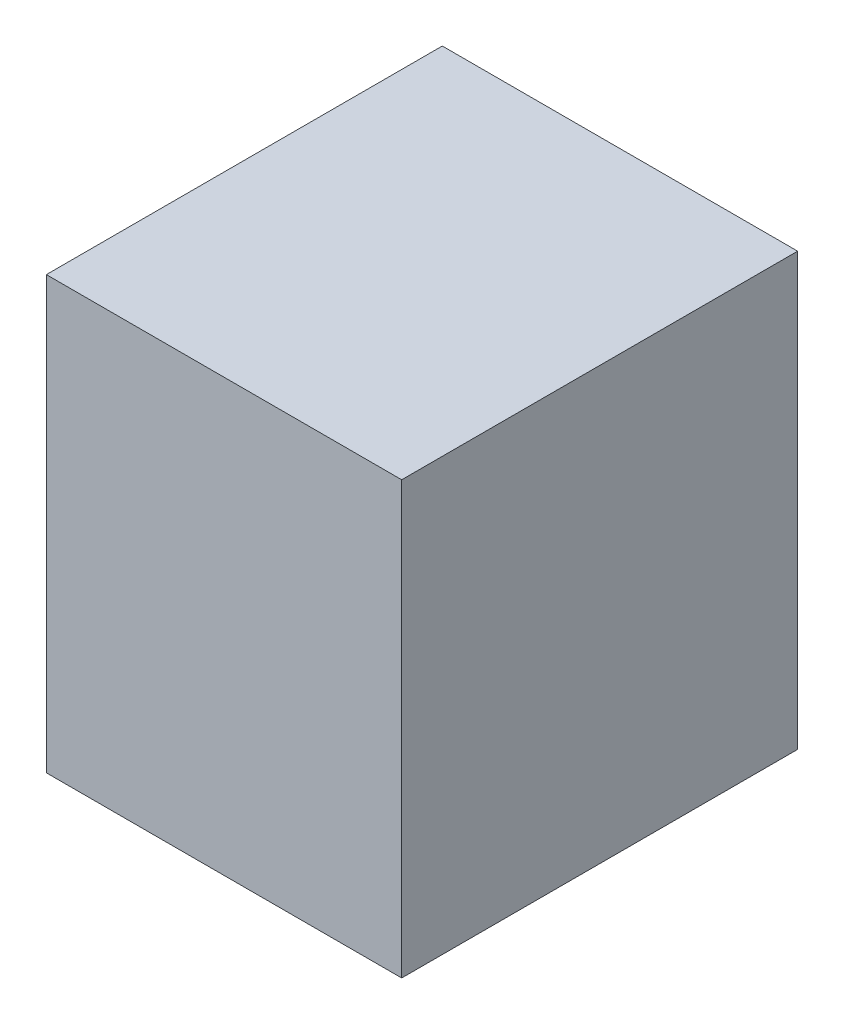
ISO-10303-21;
HEADER;
FILE_DESCRIPTION(('STEP AP214'),'2;1');
FILE_NAME('part.step','',(''),(''),'','','');
FILE_SCHEMA(('AUTOMOTIVE_DESIGN { 1 0 10303 214 1 1 1 1 }'));
ENDSEC;
DATA;
#1=APPLICATION_CONTEXT('core data for automotive mechanical design processes');
#2=APPLICATION_PROTOCOL_DEFINITION('international standard','automotive_design',2000,#1);
#3=PRODUCT_CONTEXT('',#1,'mechanical');
#4=PRODUCT('Part','Part','',(#3));
#5=PRODUCT_RELATED_PRODUCT_CATEGORY('part','',(#4));
#6=PRODUCT_DEFINITION_FORMATION('','',#4);
#7=PRODUCT_DEFINITION_CONTEXT('part definition',#1,'design');
#8=PRODUCT_DEFINITION('design','',#6,#7);
#9=PRODUCT_DEFINITION_SHAPE('','',#8);
#10=(LENGTH_UNIT() NAMED_UNIT(*) SI_UNIT(.MILLI.,.METRE.));
#11=(NAMED_UNIT(*) PLANE_ANGLE_UNIT() SI_UNIT($,.RADIAN.));
#12=(NAMED_UNIT(*) SI_UNIT($,.STERADIAN.) SOLID_ANGLE_UNIT());
#13=UNCERTAINTY_MEASURE_WITH_UNIT(LENGTH_MEASURE(1.E-05),#10,'distance_accuracy_value','');
#14=(GEOMETRIC_REPRESENTATION_CONTEXT(3) GLOBAL_UNCERTAINTY_ASSIGNED_CONTEXT((#13)) GLOBAL_UNIT_ASSIGNED_CONTEXT((#10,
#11,#12)) REPRESENTATION_CONTEXT('',''));
#15=CARTESIAN_POINT('',(0.,0.,0.));
#16=DIRECTION('',(0.,0.,1.));
#17=DIRECTION('',(1.,0.,0.));
#18=AXIS2_PLACEMENT_3D('',#15,#16,#17);
#19=CARTESIAN_POINT('',(7.,-4.25,-3.9));
#20=DIRECTION('',(0.,0.,1.));
#21=DIRECTION('',(1.,0.,0.));
#22=AXIS2_PLACEMENT_3D('',#19,#20,#21);
#23=PLANE('',#22);
#24=DIRECTION('',(0.,1.,0.));
#25=VECTOR('',#24,1.);
#26=CARTESIAN_POINT('',(0.,-4.25,-3.9));
#27=LINE('',#26,#25);
#28=CARTESIAN_POINT('',(0.,-4.25,-3.9));
#29=VERTEX_POINT('',#28);
#30=CARTESIAN_POINT('',(0.,4.25,-3.9));
#31=VERTEX_POINT('',#30);
#32=EDGE_CURVE('E107',#29,#31,#27,.T.);
#33=ORIENTED_EDGE('',*,*,#32,.T.);
#34=DIRECTION('',(-1.,0.,0.));
#35=VECTOR('',#34,1.);
#36=CARTESIAN_POINT('',(7.,4.25,-3.9));
#37=LINE('',#36,#35);
#38=CARTESIAN_POINT('',(7.,4.25,-3.9));
#39=VERTEX_POINT('',#38);
#40=EDGE_CURVE('E11',#39,#31,#37,.T.);
#41=ORIENTED_EDGE('',*,*,#40,.F.);
#42=DIRECTION('',(0.,1.,0.));
#43=VECTOR('',#42,1.);
#44=CARTESIAN_POINT('',(7.,-4.25,-3.9));
#45=LINE('',#44,#43);
#46=CARTESIAN_POINT('',(7.,-4.25,-3.9));
#47=VERTEX_POINT('',#46);
#48=EDGE_CURVE('E91',#47,#39,#45,.T.);
#49=ORIENTED_EDGE('',*,*,#48,.F.);
#50=DIRECTION('',(-1.,0.,0.));
#51=VECTOR('',#50,1.);
#52=CARTESIAN_POINT('',(7.,-4.25,-3.9));
#53=LINE('',#52,#51);
#54=EDGE_CURVE('E103',#47,#29,#53,.T.);
#55=ORIENTED_EDGE('',*,*,#54,.T.);
#56=EDGE_LOOP('',(#33,#41,#49,#55));
#57=FACE_BOUND('',#56,.T.);
#58=ADVANCED_FACE('F39',(#57),#23,.F.);
#59=CARTESIAN_POINT('',(7.,4.25,3.9));
#60=DIRECTION('',(0.,-1.,0.));
#61=DIRECTION('',(0.,0.,-1.));
#62=AXIS2_PLACEMENT_3D('',#59,#60,#61);
#63=PLANE('',#62);
#64=DIRECTION('',(0.,0.,1.));
#65=VECTOR('',#64,1.);
#66=CARTESIAN_POINT('',(0.,4.25,3.9));
#67=LINE('',#66,#65);
#68=CARTESIAN_POINT('',(0.,4.25,3.9));
#69=VERTEX_POINT('',#68);
#70=EDGE_CURVE('E96',#31,#69,#67,.T.);
#71=ORIENTED_EDGE('',*,*,#70,.T.);
#72=DIRECTION('',(-1.,0.,0.));
#73=VECTOR('',#72,1.);
#74=CARTESIAN_POINT('',(7.,4.25,3.9));
#75=LINE('',#74,#73);
#76=CARTESIAN_POINT('',(7.,4.25,3.9));
#77=VERTEX_POINT('',#76);
#78=EDGE_CURVE('E48',#77,#69,#75,.T.);
#79=ORIENTED_EDGE('',*,*,#78,.F.);
#80=DIRECTION('',(0.,0.,1.));
#81=VECTOR('',#80,1.);
#82=CARTESIAN_POINT('',(7.,4.25,3.9));
#83=LINE('',#82,#81);
#84=EDGE_CURVE('E86',#39,#77,#83,.T.);
#85=ORIENTED_EDGE('',*,*,#84,.F.);
#86=ORIENTED_EDGE('',*,*,#40,.T.);
#87=EDGE_LOOP('',(#71,#79,#85,#86));
#88=FACE_BOUND('',#87,.T.);
#89=ADVANCED_FACE('F95',(#88),#63,.F.);
#90=CARTESIAN_POINT('',(7.,-4.25,3.9));
#91=DIRECTION('',(0.,0.,-1.));
#92=DIRECTION('',(-1.,0.,0.));
#93=AXIS2_PLACEMENT_3D('',#90,#91,#92);
#94=PLANE('',#93);
#95=DIRECTION('',(0.,-1.,0.));
#96=VECTOR('',#95,1.);
#97=CARTESIAN_POINT('',(0.,-4.25,3.9));
#98=LINE('',#97,#96);
#99=CARTESIAN_POINT('',(0.,-4.25,3.9));
#100=VERTEX_POINT('',#99);
#101=EDGE_CURVE('E73',#69,#100,#98,.T.);
#102=ORIENTED_EDGE('',*,*,#101,.T.);
#103=DIRECTION('',(-1.,0.,0.));
#104=VECTOR('',#103,1.);
#105=CARTESIAN_POINT('',(7.,-4.25,3.9));
#106=LINE('',#105,#104);
#107=CARTESIAN_POINT('',(7.,-4.25,3.9));
#108=VERTEX_POINT('',#107);
#109=EDGE_CURVE('E98',#108,#100,#106,.T.);
#110=ORIENTED_EDGE('',*,*,#109,.F.);
#111=DIRECTION('',(0.,-1.,0.));
#112=VECTOR('',#111,1.);
#113=CARTESIAN_POINT('',(7.,-4.25,3.9));
#114=LINE('',#113,#112);
#115=EDGE_CURVE('E89',#77,#108,#114,.T.);
#116=ORIENTED_EDGE('',*,*,#115,.F.);
#117=ORIENTED_EDGE('',*,*,#78,.T.);
#118=EDGE_LOOP('',(#102,#110,#116,#117));
#119=FACE_BOUND('',#118,.T.);
#120=ADVANCED_FACE('F99',(#119),#94,.F.);
#121=CARTESIAN_POINT('',(7.,-4.25,3.9));
#122=DIRECTION('',(0.,1.,0.));
#123=DIRECTION('',(0.,0.,1.));
#124=AXIS2_PLACEMENT_3D('',#121,#122,#123);
#125=PLANE('',#124);
#126=DIRECTION('',(0.,0.,-1.));
#127=VECTOR('',#126,1.);
#128=CARTESIAN_POINT('',(0.,-4.25,3.9));
#129=LINE('',#128,#127);
#130=EDGE_CURVE('E79',#100,#29,#129,.T.);
#131=ORIENTED_EDGE('',*,*,#130,.T.);
#132=ORIENTED_EDGE('',*,*,#54,.F.);
#133=DIRECTION('',(0.,0.,-1.));
#134=VECTOR('',#133,1.);
#135=CARTESIAN_POINT('',(7.,-4.25,3.9));
#136=LINE('',#135,#134);
#137=EDGE_CURVE('E56',#108,#47,#136,.T.);
#138=ORIENTED_EDGE('',*,*,#137,.F.);
#139=ORIENTED_EDGE('',*,*,#109,.T.);
#140=EDGE_LOOP('',(#131,#132,#138,#139));
#141=FACE_BOUND('',#140,.T.);
#142=ADVANCED_FACE('F120',(#141),#125,.F.);
#143=CARTESIAN_POINT('',(7.,0.,0.));
#144=DIRECTION('',(-1.,0.,0.));
#145=DIRECTION('',(0.,0.,1.));
#146=AXIS2_PLACEMENT_3D('',#143,#144,#145);
#147=PLANE('',#146);
#148=ORIENTED_EDGE('',*,*,#48,.T.);
#149=ORIENTED_EDGE('',*,*,#84,.T.);
#150=ORIENTED_EDGE('',*,*,#115,.T.);
#151=ORIENTED_EDGE('',*,*,#137,.T.);
#152=EDGE_LOOP('',(#148,#149,#150,#151));
#153=FACE_BOUND('',#152,.T.);
#154=ADVANCED_FACE('F87',(#153),#147,.F.);
#155=CARTESIAN_POINT('',(0.,0.,0.));
#156=DIRECTION('',(-1.,0.,0.));
#157=DIRECTION('',(0.,0.,1.));
#158=AXIS2_PLACEMENT_3D('',#155,#156,#157);
#159=PLANE('',#158);
#160=ORIENTED_EDGE('',*,*,#32,.F.);
#161=ORIENTED_EDGE('',*,*,#130,.F.);
#162=ORIENTED_EDGE('',*,*,#101,.F.);
#163=ORIENTED_EDGE('',*,*,#70,.F.);
#164=EDGE_LOOP('',(#160,#161,#162,#163));
#165=FACE_BOUND('',#164,.T.);
#166=ADVANCED_FACE('F123',(#165),#159,.T.);
#167=CLOSED_SHELL('',(#58,#89,#120,#142,#154,#166));
#168=MANIFOLD_SOLID_BREP('B2',#167);
#169=ADVANCED_BREP_SHAPE_REPRESENTATION('',(#18,#168),#14);
#170=SHAPE_DEFINITION_REPRESENTATION(#9,#169);
ENDSEC;
END-ISO-10303-21;
